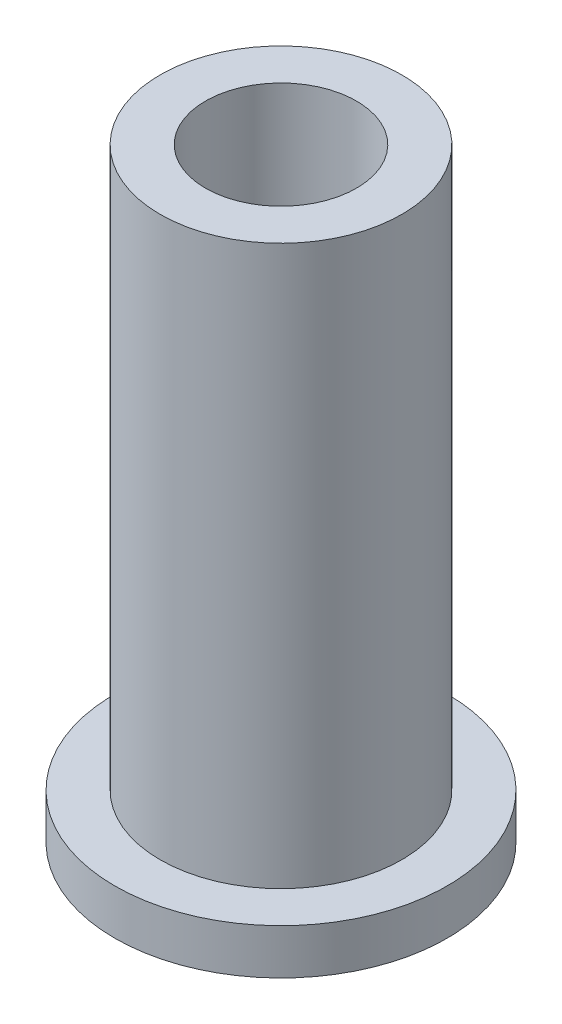
ISO-10303-21;
HEADER;
FILE_DESCRIPTION(('STEP AP214'),'2;1');
FILE_NAME('part.step','',(''),(''),'','','');
FILE_SCHEMA(('AUTOMOTIVE_DESIGN { 1 0 10303 214 1 1 1 1 }'));
ENDSEC;
DATA;
#1=APPLICATION_CONTEXT('core data for automotive mechanical design processes');
#2=APPLICATION_PROTOCOL_DEFINITION('international standard','automotive_design',2000,#1);
#3=PRODUCT_CONTEXT('',#1,'mechanical');
#4=PRODUCT('Part','Part','',(#3));
#5=PRODUCT_RELATED_PRODUCT_CATEGORY('part','',(#4));
#6=PRODUCT_DEFINITION_FORMATION('','',#4);
#7=PRODUCT_DEFINITION_CONTEXT('part definition',#1,'design');
#8=PRODUCT_DEFINITION('design','',#6,#7);
#9=PRODUCT_DEFINITION_SHAPE('','',#8);
#10=(LENGTH_UNIT() NAMED_UNIT(*) SI_UNIT(.MILLI.,.METRE.));
#11=(NAMED_UNIT(*) PLANE_ANGLE_UNIT() SI_UNIT($,.RADIAN.));
#12=(NAMED_UNIT(*) SI_UNIT($,.STERADIAN.) SOLID_ANGLE_UNIT());
#13=UNCERTAINTY_MEASURE_WITH_UNIT(LENGTH_MEASURE(1.E-05),#10,'distance_accuracy_value','');
#14=(GEOMETRIC_REPRESENTATION_CONTEXT(3) GLOBAL_UNCERTAINTY_ASSIGNED_CONTEXT((#13)) GLOBAL_UNIT_ASSIGNED_CONTEXT((#10,
#11,#12)) REPRESENTATION_CONTEXT('',''));
#15=CARTESIAN_POINT('',(0.,0.,0.));
#16=DIRECTION('',(0.,0.,1.));
#17=DIRECTION('',(1.,0.,0.));
#18=AXIS2_PLACEMENT_3D('',#15,#16,#17);
#19=CARTESIAN_POINT('',(0.,40.,0.));
#20=DIRECTION('',(0.,1.,0.));
#21=DIRECTION('',(0.,0.,1.));
#22=AXIS2_PLACEMENT_3D('',#19,#20,#21);
#23=PLANE('',#22);
#24=CARTESIAN_POINT('',(0.,40.,0.));
#25=DIRECTION('',(0.,1.,0.));
#26=DIRECTION('',(0.,0.,1.));
#27=AXIS2_PLACEMENT_3D('',#24,#25,#26);
#28=CIRCLE('',#27,8.);
#29=CARTESIAN_POINT('',(0.,40.,8.));
#30=VERTEX_POINT('',#29);
#31=EDGE_CURVE('E11',#30,#30,#28,.T.);
#32=ORIENTED_EDGE('',*,*,#31,.T.);
#33=EDGE_LOOP('',(#32));
#34=FACE_BOUND('',#33,.T.);
#35=CARTESIAN_POINT('',(0.,40.,0.));
#36=DIRECTION('',(0.,1.,0.));
#37=DIRECTION('',(0.,0.,1.));
#38=AXIS2_PLACEMENT_3D('',#35,#36,#37);
#39=CIRCLE('',#38,5.);
#40=CARTESIAN_POINT('',(0.,40.,5.));
#41=VERTEX_POINT('',#40);
#42=EDGE_CURVE('E48',#41,#41,#39,.T.);
#43=ORIENTED_EDGE('',*,*,#42,.F.);
#44=EDGE_LOOP('',(#43));
#45=FACE_BOUND('',#44,.T.);
#46=ADVANCED_FACE('F41',(#34,#45),#23,.T.);
#47=CARTESIAN_POINT('',(0.,0.,0.));
#48=DIRECTION('',(0.,1.,0.));
#49=DIRECTION('',(0.,0.,1.));
#50=AXIS2_PLACEMENT_3D('',#47,#48,#49);
#51=PLANE('',#50);
#52=CARTESIAN_POINT('',(0.,0.,0.));
#53=DIRECTION('',(0.,1.,0.));
#54=DIRECTION('',(0.,0.,1.));
#55=AXIS2_PLACEMENT_3D('',#52,#53,#54);
#56=CIRCLE('',#55,5.);
#57=CARTESIAN_POINT('',(0.,0.,5.));
#58=VERTEX_POINT('',#57);
#59=EDGE_CURVE('E52',#58,#58,#56,.T.);
#60=ORIENTED_EDGE('',*,*,#59,.T.);
#61=EDGE_LOOP('',(#60));
#62=FACE_BOUND('',#61,.T.);
#63=CARTESIAN_POINT('',(0.,0.,0.));
#64=DIRECTION('',(0.,1.,0.));
#65=DIRECTION('',(0.,0.,1.));
#66=AXIS2_PLACEMENT_3D('',#63,#64,#65);
#67=CIRCLE('',#66,11.);
#68=CARTESIAN_POINT('',(0.,0.,11.));
#69=VERTEX_POINT('',#68);
#70=EDGE_CURVE('E59',#69,#69,#67,.T.);
#71=ORIENTED_EDGE('',*,*,#70,.F.);
#72=EDGE_LOOP('',(#71));
#73=FACE_BOUND('',#72,.T.);
#74=ADVANCED_FACE('F84',(#62,#73),#51,.F.);
#75=CARTESIAN_POINT('',(0.,40.,0.));
#76=DIRECTION('',(0.,-1.,0.));
#77=DIRECTION('',(0.,0.,-1.));
#78=AXIS2_PLACEMENT_3D('',#75,#76,#77);
#79=CYLINDRICAL_SURFACE('',#78,8.);
#80=CARTESIAN_POINT('',(0.,3.,0.));
#81=DIRECTION('',(0.,1.,0.));
#82=DIRECTION('',(0.,0.,1.));
#83=AXIS2_PLACEMENT_3D('',#80,#81,#82);
#84=CIRCLE('',#83,8.);
#85=CARTESIAN_POINT('',(0.,3.,8.));
#86=VERTEX_POINT('',#85);
#87=EDGE_CURVE('E62',#86,#86,#84,.T.);
#88=ORIENTED_EDGE('',*,*,#87,.T.);
#89=EDGE_LOOP('',(#88));
#90=FACE_BOUND('',#89,.T.);
#91=ORIENTED_EDGE('',*,*,#31,.F.);
#92=EDGE_LOOP('',(#91));
#93=FACE_BOUND('',#92,.T.);
#94=ADVANCED_FACE('F43',(#90,#93),#79,.T.);
#95=CARTESIAN_POINT('',(0.,40.,0.));
#96=DIRECTION('',(0.,-1.,0.));
#97=DIRECTION('',(0.,0.,-1.));
#98=AXIS2_PLACEMENT_3D('',#95,#96,#97);
#99=CYLINDRICAL_SURFACE('',#98,5.);
#100=ORIENTED_EDGE('',*,*,#42,.T.);
#101=EDGE_LOOP('',(#100));
#102=FACE_BOUND('',#101,.T.);
#103=ORIENTED_EDGE('',*,*,#59,.F.);
#104=EDGE_LOOP('',(#103));
#105=FACE_BOUND('',#104,.T.);
#106=ADVANCED_FACE('F73',(#102,#105),#99,.F.);
#107=CARTESIAN_POINT('',(0.,3.,0.));
#108=DIRECTION('',(0.,1.,0.));
#109=DIRECTION('',(0.,0.,1.));
#110=AXIS2_PLACEMENT_3D('',#107,#108,#109);
#111=PLANE('',#110);
#112=CARTESIAN_POINT('',(0.,3.,0.));
#113=DIRECTION('',(0.,1.,0.));
#114=DIRECTION('',(0.,0.,1.));
#115=AXIS2_PLACEMENT_3D('',#112,#113,#114);
#116=CIRCLE('',#115,11.);
#117=CARTESIAN_POINT('',(0.,3.,11.));
#118=VERTEX_POINT('',#117);
#119=EDGE_CURVE('E57',#118,#118,#116,.T.);
#120=ORIENTED_EDGE('',*,*,#119,.T.);
#121=EDGE_LOOP('',(#120));
#122=FACE_BOUND('',#121,.T.);
#123=ORIENTED_EDGE('',*,*,#87,.F.);
#124=EDGE_LOOP('',(#123));
#125=FACE_BOUND('',#124,.T.);
#126=ADVANCED_FACE('F70',(#122,#125),#111,.T.);
#127=CARTESIAN_POINT('',(0.,3.,0.));
#128=DIRECTION('',(0.,-1.,0.));
#129=DIRECTION('',(0.,0.,-1.));
#130=AXIS2_PLACEMENT_3D('',#127,#128,#129);
#131=CYLINDRICAL_SURFACE('',#130,11.);
#132=ORIENTED_EDGE('',*,*,#119,.F.);
#133=EDGE_LOOP('',(#132));
#134=FACE_BOUND('',#133,.T.);
#135=ORIENTED_EDGE('',*,*,#70,.T.);
#136=EDGE_LOOP('',(#135));
#137=FACE_BOUND('',#136,.T.);
#138=ADVANCED_FACE('F72',(#134,#137),#131,.T.);
#139=CLOSED_SHELL('',(#46,#74,#94,#106,#126,#138));
#140=MANIFOLD_SOLID_BREP('B2',#139);
#141=ADVANCED_BREP_SHAPE_REPRESENTATION('',(#18,#140),#14);
#142=SHAPE_DEFINITION_REPRESENTATION(#9,#141);
ENDSEC;
END-ISO-10303-21;
